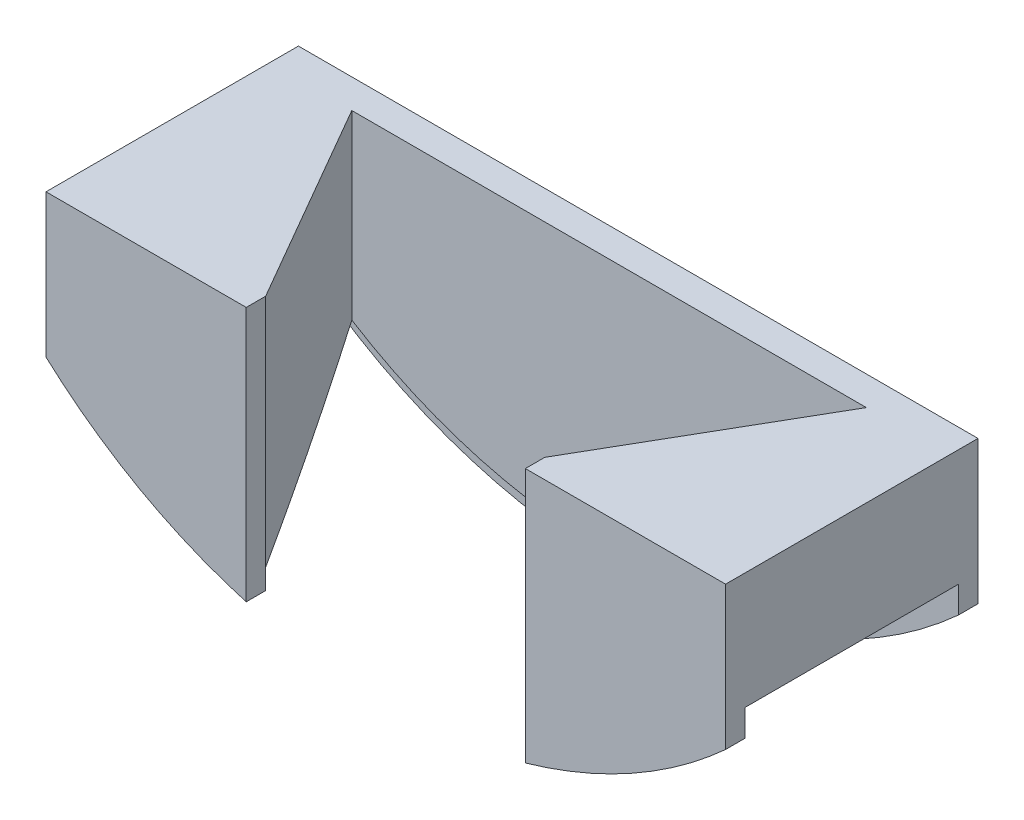
ISO-10303-21;
HEADER;
FILE_DESCRIPTION(('STEP AP214'),'2;1');
FILE_NAME('part.step','',(''),(''),'','','');
FILE_SCHEMA(('AUTOMOTIVE_DESIGN { 1 0 10303 214 1 1 1 1 }'));
ENDSEC;
DATA;
#1=APPLICATION_CONTEXT('core data for automotive mechanical design processes');
#2=APPLICATION_PROTOCOL_DEFINITION('international standard','automotive_design',2000,#1);
#3=PRODUCT_CONTEXT('',#1,'mechanical');
#4=PRODUCT('Part','Part','',(#3));
#5=PRODUCT_RELATED_PRODUCT_CATEGORY('part','',(#4));
#6=PRODUCT_DEFINITION_FORMATION('','',#4);
#7=PRODUCT_DEFINITION_CONTEXT('part definition',#1,'design');
#8=PRODUCT_DEFINITION('design','',#6,#7);
#9=PRODUCT_DEFINITION_SHAPE('','',#8);
#10=(LENGTH_UNIT() NAMED_UNIT(*) SI_UNIT(.MILLI.,.METRE.));
#11=(NAMED_UNIT(*) PLANE_ANGLE_UNIT() SI_UNIT($,.RADIAN.));
#12=(NAMED_UNIT(*) SI_UNIT($,.STERADIAN.) SOLID_ANGLE_UNIT());
#13=UNCERTAINTY_MEASURE_WITH_UNIT(LENGTH_MEASURE(1.E-05),#10,'distance_accuracy_value','');
#14=(GEOMETRIC_REPRESENTATION_CONTEXT(3) GLOBAL_UNCERTAINTY_ASSIGNED_CONTEXT((#13)) GLOBAL_UNIT_ASSIGNED_CONTEXT((#10,
#11,#12)) REPRESENTATION_CONTEXT('',''));
#15=CARTESIAN_POINT('',(0.,0.,0.));
#16=DIRECTION('',(0.,0.,1.));
#17=DIRECTION('',(1.,0.,0.));
#18=AXIS2_PLACEMENT_3D('',#15,#16,#17);
#19=CARTESIAN_POINT('',(0.,14.8535710713571,0.));
#20=DIRECTION('',(0.,0.,1.));
#21=DIRECTION('',(1.,0.,0.));
#22=AXIS2_PLACEMENT_3D('',#19,#20,#21);
#23=CYLINDRICAL_SURFACE('',#22,25.);
#24=DIRECTION('',(0.,0.,-1.));
#25=VECTOR('',#24,1.);
#26=CARTESIAN_POINT('',(-17.5,-3.,12.));
#27=LINE('',#26,#25);
#28=CARTESIAN_POINT('',(-17.5,-3.,12.));
#29=VERTEX_POINT('',#28);
#30=CARTESIAN_POINT('',(-17.5,-3.,1.));
#31=VERTEX_POINT('',#30);
#32=EDGE_CURVE('E53',#29,#31,#27,.T.);
#33=ORIENTED_EDGE('',*,*,#32,.T.);
#34=CARTESIAN_POINT('',(0.,14.8535710713571,1.));
#35=DIRECTION('',(0.,0.,1.));
#36=DIRECTION('',(-1.,0.,0.));
#37=AXIS2_PLACEMENT_3D('',#34,#35,#36);
#38=CIRCLE('',#37,25.);
#39=CARTESIAN_POINT('',(17.5,-3.,1.));
#40=VERTEX_POINT('',#39);
#41=EDGE_CURVE('E48',#31,#40,#38,.T.);
#42=ORIENTED_EDGE('',*,*,#41,.T.);
#43=DIRECTION('',(0.,0.,-1.));
#44=VECTOR('',#43,1.);
#45=CARTESIAN_POINT('',(17.5,-3.,12.));
#46=LINE('',#45,#44);
#47=CARTESIAN_POINT('',(17.5,-3.,12.));
#48=VERTEX_POINT('',#47);
#49=EDGE_CURVE('E257',#48,#40,#46,.T.);
#50=ORIENTED_EDGE('',*,*,#49,.F.);
#51=CARTESIAN_POINT('',(0.,14.8535710713571,12.));
#52=DIRECTION('',(0.,0.,1.));
#53=DIRECTION('',(1.,0.,0.));
#54=AXIS2_PLACEMENT_3D('',#51,#52,#53);
#55=CIRCLE('',#54,25.);
#56=CARTESIAN_POINT('',(7.18782217350886,-9.09084816156674,12.));
#57=VERTEX_POINT('',#56);
#58=EDGE_CURVE('E247',#57,#48,#55,.T.);
#59=ORIENTED_EDGE('',*,*,#58,.F.);
#60=CARTESIAN_POINT('',(0.,14.8535710713571,24.4496732002874));
#61=DIRECTION('',(0.866025403784436,0.,0.500000000000004));
#62=DIRECTION('',(-0.500000000000004,0.,0.866025403784436));
#63=AXIS2_PLACEMENT_3D('',#60,#61,#62);
#64=ELLIPSE('',#63,49.9999999999996,25.);
#65=CARTESIAN_POINT('',(13.25,-6.34636996629673,1.5));
#66=VERTEX_POINT('',#65);
#67=EDGE_CURVE('E234',#66,#57,#64,.F.);
#68=ORIENTED_EDGE('',*,*,#67,.F.);
#69=CARTESIAN_POINT('',(0.,14.8535710713571,1.5));
#70=DIRECTION('',(0.,0.,-1.));
#71=DIRECTION('',(-1.,0.,0.));
#72=AXIS2_PLACEMENT_3D('',#69,#70,#71);
#73=CIRCLE('',#72,25.);
#74=CARTESIAN_POINT('',(-13.25,-6.34636996629673,1.5));
#75=VERTEX_POINT('',#74);
#76=EDGE_CURVE('E243',#75,#66,#73,.F.);
#77=ORIENTED_EDGE('',*,*,#76,.F.);
#78=CARTESIAN_POINT('',(0.,14.8535710713571,24.4496732002874));
#79=DIRECTION('',(-0.866025403784436,0.,0.500000000000004));
#80=DIRECTION('',(0.500000000000004,0.,0.866025403784436));
#81=AXIS2_PLACEMENT_3D('',#78,#79,#80);
#82=ELLIPSE('',#81,49.9999999999996,25.);
#83=CARTESIAN_POINT('',(-7.18782217350886,-9.09084816156674,12.));
#84=VERTEX_POINT('',#83);
#85=EDGE_CURVE('E245',#84,#75,#82,.F.);
#86=ORIENTED_EDGE('',*,*,#85,.F.);
#87=EDGE_CURVE('E248',#29,#84,#55,.T.);
#88=ORIENTED_EDGE('',*,*,#87,.F.);
#89=EDGE_LOOP('',(#33,#42,#50,#59,#68,#77,#86,#88));
#90=FACE_BOUND('',#89,.T.);
#91=ADVANCED_FACE('F33',(#90),#23,.T.);
#92=CARTESIAN_POINT('',(-17.5,3.,12.));
#93=DIRECTION('',(0.,-1.,0.));
#94=DIRECTION('',(0.,0.,-1.));
#95=AXIS2_PLACEMENT_3D('',#92,#93,#94);
#96=PLANE('',#95);
#97=DIRECTION('',(-1.,0.,0.));
#98=VECTOR('',#97,1.);
#99=CARTESIAN_POINT('',(-13.25,3.,1.5));
#100=LINE('',#99,#98);
#101=CARTESIAN_POINT('',(13.25,3.,1.5));
#102=VERTEX_POINT('',#101);
#103=CARTESIAN_POINT('',(-13.25,3.,1.5));
#104=VERTEX_POINT('',#103);
#105=EDGE_CURVE('E225',#102,#104,#100,.T.);
#106=ORIENTED_EDGE('',*,*,#105,.F.);
#107=DIRECTION('',(0.500000000000004,0.,-0.866025403784436));
#108=VECTOR('',#107,1.);
#109=CARTESIAN_POINT('',(13.25,3.,1.5));
#110=LINE('',#109,#108);
#111=CARTESIAN_POINT('',(7.18782217350886,3.,12.));
#112=VERTEX_POINT('',#111);
#113=EDGE_CURVE('E222',#112,#102,#110,.T.);
#114=ORIENTED_EDGE('',*,*,#113,.F.);
#115=DIRECTION('',(0.,0.,-1.));
#116=VECTOR('',#115,1.);
#117=CARTESIAN_POINT('',(7.18782217350886,3.,13.));
#118=LINE('',#117,#116);
#119=CARTESIAN_POINT('',(7.18782217350886,3.,13.));
#120=VERTEX_POINT('',#119);
#121=EDGE_CURVE('E209',#120,#112,#118,.T.);
#122=ORIENTED_EDGE('',*,*,#121,.F.);
#123=DIRECTION('',(-1.,0.,0.));
#124=VECTOR('',#123,1.);
#125=CARTESIAN_POINT('',(17.5,3.,13.));
#126=LINE('',#125,#124);
#127=CARTESIAN_POINT('',(17.5,3.,13.));
#128=VERTEX_POINT('',#127);
#129=EDGE_CURVE('E207',#128,#120,#126,.T.);
#130=ORIENTED_EDGE('',*,*,#129,.F.);
#131=DIRECTION('',(0.,0.,-1.));
#132=VECTOR('',#131,1.);
#133=CARTESIAN_POINT('',(17.5,3.,12.));
#134=LINE('',#133,#132);
#135=CARTESIAN_POINT('',(17.5,3.,0.));
#136=VERTEX_POINT('',#135);
#137=EDGE_CURVE('E11',#128,#136,#134,.T.);
#138=ORIENTED_EDGE('',*,*,#137,.T.);
#139=DIRECTION('',(-1.,0.,0.));
#140=VECTOR('',#139,1.);
#141=CARTESIAN_POINT('',(-17.5,3.,0.));
#142=LINE('',#141,#140);
#143=CARTESIAN_POINT('',(-17.5,3.,0.));
#144=VERTEX_POINT('',#143);
#145=EDGE_CURVE('E254',#136,#144,#142,.T.);
#146=ORIENTED_EDGE('',*,*,#145,.T.);
#147=DIRECTION('',(0.,0.,-1.));
#148=VECTOR('',#147,1.);
#149=CARTESIAN_POINT('',(-17.5,3.,12.));
#150=LINE('',#149,#148);
#151=CARTESIAN_POINT('',(-17.5,3.,13.));
#152=VERTEX_POINT('',#151);
#153=EDGE_CURVE('E41',#152,#144,#150,.T.);
#154=ORIENTED_EDGE('',*,*,#153,.F.);
#155=DIRECTION('',(1.,0.,0.));
#156=VECTOR('',#155,1.);
#157=CARTESIAN_POINT('',(-17.5,3.,13.));
#158=LINE('',#157,#156);
#159=CARTESIAN_POINT('',(-7.18782217350886,3.,13.));
#160=VERTEX_POINT('',#159);
#161=EDGE_CURVE('E173',#152,#160,#158,.T.);
#162=ORIENTED_EDGE('',*,*,#161,.T.);
#163=DIRECTION('',(0.,0.,-1.));
#164=VECTOR('',#163,1.);
#165=CARTESIAN_POINT('',(-7.18782217350886,3.,13.));
#166=LINE('',#165,#164);
#167=CARTESIAN_POINT('',(-7.18782217350886,3.,12.));
#168=VERTEX_POINT('',#167);
#169=EDGE_CURVE('E194',#160,#168,#166,.T.);
#170=ORIENTED_EDGE('',*,*,#169,.T.);
#171=DIRECTION('',(0.500000000000004,0.,0.866025403784436));
#172=VECTOR('',#171,1.);
#173=CARTESIAN_POINT('',(-7.18782217350886,3.,12.));
#174=LINE('',#173,#172);
#175=EDGE_CURVE('E228',#104,#168,#174,.T.);
#176=ORIENTED_EDGE('',*,*,#175,.F.);
#177=EDGE_LOOP('',(#106,#114,#122,#130,#138,#146,#154,#162,#170,#176));
#178=FACE_BOUND('',#177,.T.);
#179=ADVANCED_FACE('F302',(#178),#96,.F.);
#180=CARTESIAN_POINT('',(17.5,-3.,12.));
#181=DIRECTION('',(-1.,0.,0.));
#182=DIRECTION('',(0.,0.,1.));
#183=AXIS2_PLACEMENT_3D('',#180,#181,#182);
#184=PLANE('',#183);
#185=DIRECTION('',(0.,1.,0.));
#186=VECTOR('',#185,1.);
#187=CARTESIAN_POINT('',(17.5,-3.,0.));
#188=LINE('',#187,#186);
#189=CARTESIAN_POINT('',(17.5,-4.3753134516723,0.));
#190=VERTEX_POINT('',#189);
#191=EDGE_CURVE('E251',#190,#136,#188,.T.);
#192=ORIENTED_EDGE('',*,*,#191,.T.);
#193=ORIENTED_EDGE('',*,*,#137,.F.);
#194=DIRECTION('',(0.,1.,0.));
#195=VECTOR('',#194,1.);
#196=CARTESIAN_POINT('',(17.5,-4.37531345167228,13.));
#197=LINE('',#196,#195);
#198=CARTESIAN_POINT('',(17.5,-4.3753134516723,13.));
#199=VERTEX_POINT('',#198);
#200=EDGE_CURVE('E204',#199,#128,#197,.T.);
#201=ORIENTED_EDGE('',*,*,#200,.F.);
#202=DIRECTION('',(0.,0.,-1.));
#203=VECTOR('',#202,1.);
#204=CARTESIAN_POINT('',(17.5,-4.3753134516723,13.));
#205=LINE('',#204,#203);
#206=CARTESIAN_POINT('',(17.5,-4.3753134516723,12.));
#207=VERTEX_POINT('',#206);
#208=EDGE_CURVE('E216',#199,#207,#205,.T.);
#209=ORIENTED_EDGE('',*,*,#208,.T.);
#210=DIRECTION('',(0.,1.,0.));
#211=VECTOR('',#210,1.);
#212=CARTESIAN_POINT('',(17.5,-4.37531345167228,12.));
#213=LINE('',#212,#211);
#214=EDGE_CURVE('E202',#207,#48,#213,.T.);
#215=ORIENTED_EDGE('',*,*,#214,.T.);
#216=ORIENTED_EDGE('',*,*,#49,.T.);
#217=DIRECTION('',(0.,-1.,0.));
#218=VECTOR('',#217,1.);
#219=CARTESIAN_POINT('',(17.5,-4.3753134516723,1.));
#220=LINE('',#219,#218);
#221=CARTESIAN_POINT('',(17.5,-4.3753134516723,1.));
#222=VERTEX_POINT('',#221);
#223=EDGE_CURVE('E151',#40,#222,#220,.T.);
#224=ORIENTED_EDGE('',*,*,#223,.T.);
#225=DIRECTION('',(0.,0.,-1.));
#226=VECTOR('',#225,1.);
#227=CARTESIAN_POINT('',(17.5,-4.3753134516723,1.));
#228=LINE('',#227,#226);
#229=EDGE_CURVE('E150',#222,#190,#228,.T.);
#230=ORIENTED_EDGE('',*,*,#229,.T.);
#231=EDGE_LOOP('',(#192,#193,#201,#209,#215,#216,#224,#230));
#232=FACE_BOUND('',#231,.T.);
#233=ADVANCED_FACE('F35',(#232),#184,.F.);
#234=CARTESIAN_POINT('',(-17.5,-3.,12.));
#235=DIRECTION('',(1.,0.,0.));
#236=DIRECTION('',(0.,0.,-1.));
#237=AXIS2_PLACEMENT_3D('',#234,#235,#236);
#238=PLANE('',#237);
#239=DIRECTION('',(0.,-1.,0.));
#240=VECTOR('',#239,1.);
#241=CARTESIAN_POINT('',(-17.5,-3.,0.));
#242=LINE('',#241,#240);
#243=CARTESIAN_POINT('',(-17.5,-4.3753134516723,0.));
#244=VERTEX_POINT('',#243);
#245=EDGE_CURVE('E145',#144,#244,#242,.T.);
#246=ORIENTED_EDGE('',*,*,#245,.T.);
#247=DIRECTION('',(0.,0.,-1.));
#248=VECTOR('',#247,1.);
#249=CARTESIAN_POINT('',(-17.5,-4.3753134516723,1.));
#250=LINE('',#249,#248);
#251=CARTESIAN_POINT('',(-17.5,-4.3753134516723,1.));
#252=VERTEX_POINT('',#251);
#253=EDGE_CURVE('E139',#252,#244,#250,.T.);
#254=ORIENTED_EDGE('',*,*,#253,.F.);
#255=DIRECTION('',(0.,1.,0.));
#256=VECTOR('',#255,1.);
#257=CARTESIAN_POINT('',(-17.5,-4.3753134516723,1.));
#258=LINE('',#257,#256);
#259=EDGE_CURVE('E142',#252,#31,#258,.T.);
#260=ORIENTED_EDGE('',*,*,#259,.T.);
#261=ORIENTED_EDGE('',*,*,#32,.F.);
#262=DIRECTION('',(0.,1.,0.));
#263=VECTOR('',#262,1.);
#264=CARTESIAN_POINT('',(-17.5,-4.37531345167228,12.));
#265=LINE('',#264,#263);
#266=CARTESIAN_POINT('',(-17.5,-4.3753134516723,12.));
#267=VERTEX_POINT('',#266);
#268=EDGE_CURVE('E185',#267,#29,#265,.T.);
#269=ORIENTED_EDGE('',*,*,#268,.F.);
#270=DIRECTION('',(0.,0.,-1.));
#271=VECTOR('',#270,1.);
#272=CARTESIAN_POINT('',(-17.5,-4.3753134516723,13.));
#273=LINE('',#272,#271);
#274=CARTESIAN_POINT('',(-17.5,-4.3753134516723,13.));
#275=VERTEX_POINT('',#274);
#276=EDGE_CURVE('E192',#275,#267,#273,.T.);
#277=ORIENTED_EDGE('',*,*,#276,.F.);
#278=DIRECTION('',(0.,1.,0.));
#279=VECTOR('',#278,1.);
#280=CARTESIAN_POINT('',(-17.5,-4.37531345167228,13.));
#281=LINE('',#280,#279);
#282=EDGE_CURVE('E177',#275,#152,#281,.T.);
#283=ORIENTED_EDGE('',*,*,#282,.T.);
#284=ORIENTED_EDGE('',*,*,#153,.T.);
#285=EDGE_LOOP('',(#246,#254,#260,#261,#269,#277,#283,#284));
#286=FACE_BOUND('',#285,.T.);
#287=ADVANCED_FACE('F141',(#286),#238,.F.);
#288=CARTESIAN_POINT('',(0.,0.,0.));
#289=DIRECTION('',(0.,0.,-1.));
#290=DIRECTION('',(-1.,0.,0.));
#291=AXIS2_PLACEMENT_3D('',#288,#289,#290);
#292=PLANE('',#291);
#293=ORIENTED_EDGE('',*,*,#191,.F.);
#294=CARTESIAN_POINT('',(0.,14.8535710713571,0.));
#295=DIRECTION('',(0.,0.,-1.));
#296=DIRECTION('',(-1.,0.,0.));
#297=AXIS2_PLACEMENT_3D('',#294,#295,#296);
#298=CIRCLE('',#297,26.);
#299=EDGE_CURVE('E162',#190,#244,#298,.T.);
#300=ORIENTED_EDGE('',*,*,#299,.T.);
#301=ORIENTED_EDGE('',*,*,#245,.F.);
#302=ORIENTED_EDGE('',*,*,#145,.F.);
#303=EDGE_LOOP('',(#293,#300,#301,#302));
#304=FACE_BOUND('',#303,.T.);
#305=ADVANCED_FACE('F263',(#304),#292,.T.);
#306=CARTESIAN_POINT('',(13.25,-10.1464289286429,1.5));
#307=DIRECTION('',(0.866025403784436,0.,0.500000000000004));
#308=DIRECTION('',(0.500000000000004,0.,-0.866025403784436));
#309=AXIS2_PLACEMENT_3D('',#306,#307,#308);
#310=PLANE('',#309);
#311=ORIENTED_EDGE('',*,*,#67,.T.);
#312=DIRECTION('',(0.,1.,0.));
#313=VECTOR('',#312,1.);
#314=CARTESIAN_POINT('',(7.18782217350886,-10.1464289286429,12.));
#315=LINE('',#314,#313);
#316=EDGE_CURVE('E231',#57,#112,#315,.T.);
#317=ORIENTED_EDGE('',*,*,#316,.T.);
#318=ORIENTED_EDGE('',*,*,#113,.T.);
#319=DIRECTION('',(0.,1.,0.));
#320=VECTOR('',#319,1.);
#321=CARTESIAN_POINT('',(13.25,-10.1464289286429,1.5));
#322=LINE('',#321,#320);
#323=EDGE_CURVE('E230',#66,#102,#322,.T.);
#324=ORIENTED_EDGE('',*,*,#323,.F.);
#325=EDGE_LOOP('',(#311,#317,#318,#324));
#326=FACE_BOUND('',#325,.T.);
#327=ADVANCED_FACE('F281',(#326),#310,.F.);
#328=CARTESIAN_POINT('',(-7.18782217350886,-10.1464289286429,12.));
#329=DIRECTION('',(-0.866025403784436,0.,0.500000000000004));
#330=DIRECTION('',(0.500000000000004,0.,0.866025403784436));
#331=AXIS2_PLACEMENT_3D('',#328,#329,#330);
#332=PLANE('',#331);
#333=ORIENTED_EDGE('',*,*,#85,.T.);
#334=DIRECTION('',(0.,1.,0.));
#335=VECTOR('',#334,1.);
#336=CARTESIAN_POINT('',(-13.25,-10.1464289286429,1.5));
#337=LINE('',#336,#335);
#338=EDGE_CURVE('E238',#75,#104,#337,.T.);
#339=ORIENTED_EDGE('',*,*,#338,.T.);
#340=ORIENTED_EDGE('',*,*,#175,.T.);
#341=DIRECTION('',(0.,1.,0.));
#342=VECTOR('',#341,1.);
#343=CARTESIAN_POINT('',(-7.18782217350886,-10.1464289286429,12.));
#344=LINE('',#343,#342);
#345=EDGE_CURVE('E235',#84,#168,#344,.T.);
#346=ORIENTED_EDGE('',*,*,#345,.F.);
#347=EDGE_LOOP('',(#333,#339,#340,#346));
#348=FACE_BOUND('',#347,.T.);
#349=ADVANCED_FACE('F303',(#348),#332,.F.);
#350=CARTESIAN_POINT('',(-13.25,-10.1464289286429,1.5));
#351=DIRECTION('',(0.,0.,-1.));
#352=DIRECTION('',(-1.,0.,0.));
#353=AXIS2_PLACEMENT_3D('',#350,#351,#352);
#354=PLANE('',#353);
#355=ORIENTED_EDGE('',*,*,#76,.T.);
#356=ORIENTED_EDGE('',*,*,#323,.T.);
#357=ORIENTED_EDGE('',*,*,#105,.T.);
#358=ORIENTED_EDGE('',*,*,#338,.F.);
#359=EDGE_LOOP('',(#355,#356,#357,#358));
#360=FACE_BOUND('',#359,.T.);
#361=ADVANCED_FACE('F284',(#360),#354,.F.);
#362=CARTESIAN_POINT('',(7.18782217350886,3.,13.));
#363=DIRECTION('',(1.,0.,0.));
#364=DIRECTION('',(0.,0.,-1.));
#365=AXIS2_PLACEMENT_3D('',#362,#363,#364);
#366=PLANE('',#365);
#367=ORIENTED_EDGE('',*,*,#316,.F.);
#368=DIRECTION('',(0.,-1.,0.));
#369=VECTOR('',#368,1.);
#370=CARTESIAN_POINT('',(7.18782217350886,3.,12.));
#371=LINE('',#370,#369);
#372=CARTESIAN_POINT('',(7.18782217350885,-10.1331296392612,12.));
#373=VERTEX_POINT('',#372);
#374=EDGE_CURVE('E197',#57,#373,#371,.T.);
#375=ORIENTED_EDGE('',*,*,#374,.T.);
#376=DIRECTION('',(0.,0.,-1.));
#377=VECTOR('',#376,1.);
#378=CARTESIAN_POINT('',(7.18782217350885,-10.1331296392612,13.));
#379=LINE('',#378,#377);
#380=CARTESIAN_POINT('',(7.18782217350885,-10.1331296392612,13.));
#381=VERTEX_POINT('',#380);
#382=EDGE_CURVE('E219',#381,#373,#379,.T.);
#383=ORIENTED_EDGE('',*,*,#382,.F.);
#384=DIRECTION('',(0.,-1.,0.));
#385=VECTOR('',#384,1.);
#386=CARTESIAN_POINT('',(7.18782217350886,3.,13.));
#387=LINE('',#386,#385);
#388=EDGE_CURVE('E198',#120,#381,#387,.T.);
#389=ORIENTED_EDGE('',*,*,#388,.F.);
#390=ORIENTED_EDGE('',*,*,#121,.T.);
#391=EDGE_LOOP('',(#367,#375,#383,#389,#390));
#392=FACE_BOUND('',#391,.T.);
#393=ADVANCED_FACE('F275',(#392),#366,.F.);
#394=CARTESIAN_POINT('',(0.,14.8535710713571,13.));
#395=DIRECTION('',(0.,0.,-1.));
#396=DIRECTION('',(-1.,0.,0.));
#397=AXIS2_PLACEMENT_3D('',#394,#395,#396);
#398=CYLINDRICAL_SURFACE('',#397,26.);
#399=CARTESIAN_POINT('',(0.,14.8535710713571,12.));
#400=DIRECTION('',(0.,0.,1.));
#401=DIRECTION('',(1.,0.,0.));
#402=AXIS2_PLACEMENT_3D('',#399,#400,#401);
#403=CIRCLE('',#402,26.);
#404=EDGE_CURVE('E211',#373,#207,#403,.T.);
#405=ORIENTED_EDGE('',*,*,#404,.T.);
#406=ORIENTED_EDGE('',*,*,#208,.F.);
#407=CARTESIAN_POINT('',(0.,14.8535710713571,13.));
#408=DIRECTION('',(0.,0.,1.));
#409=DIRECTION('',(1.,0.,0.));
#410=AXIS2_PLACEMENT_3D('',#407,#408,#409);
#411=CIRCLE('',#410,26.);
#412=EDGE_CURVE('E201',#381,#199,#411,.T.);
#413=ORIENTED_EDGE('',*,*,#412,.F.);
#414=ORIENTED_EDGE('',*,*,#382,.T.);
#415=EDGE_LOOP('',(#405,#406,#413,#414));
#416=FACE_BOUND('',#415,.T.);
#417=ADVANCED_FACE('F369',(#416),#398,.T.);
#418=CARTESIAN_POINT('',(0.,14.8535710713571,13.));
#419=DIRECTION('',(0.,0.,1.));
#420=DIRECTION('',(1.,0.,0.));
#421=AXIS2_PLACEMENT_3D('',#418,#419,#420);
#422=PLANE('',#421);
#423=ORIENTED_EDGE('',*,*,#388,.T.);
#424=ORIENTED_EDGE('',*,*,#412,.T.);
#425=ORIENTED_EDGE('',*,*,#200,.T.);
#426=ORIENTED_EDGE('',*,*,#129,.T.);
#427=EDGE_LOOP('',(#423,#424,#425,#426));
#428=FACE_BOUND('',#427,.T.);
#429=ADVANCED_FACE('F361',(#428),#422,.T.);
#430=CARTESIAN_POINT('',(0.,14.8535710713571,12.));
#431=DIRECTION('',(0.,0.,1.));
#432=DIRECTION('',(1.,0.,0.));
#433=AXIS2_PLACEMENT_3D('',#430,#431,#432);
#434=PLANE('',#433);
#435=ORIENTED_EDGE('',*,*,#58,.T.);
#436=ORIENTED_EDGE('',*,*,#214,.F.);
#437=ORIENTED_EDGE('',*,*,#404,.F.);
#438=ORIENTED_EDGE('',*,*,#374,.F.);
#439=EDGE_LOOP('',(#435,#436,#437,#438));
#440=FACE_BOUND('',#439,.T.);
#441=ADVANCED_FACE('F270',(#440),#434,.F.);
#442=CARTESIAN_POINT('',(-7.18782217350886,3.,13.));
#443=DIRECTION('',(1.,0.,0.));
#444=DIRECTION('',(0.,0.,-1.));
#445=AXIS2_PLACEMENT_3D('',#442,#443,#444);
#446=PLANE('',#445);
#447=ORIENTED_EDGE('',*,*,#345,.T.);
#448=ORIENTED_EDGE('',*,*,#169,.F.);
#449=DIRECTION('',(0.,-1.,0.));
#450=VECTOR('',#449,1.);
#451=CARTESIAN_POINT('',(-7.18782217350886,3.,13.));
#452=LINE('',#451,#450);
#453=CARTESIAN_POINT('',(-7.18782217350885,-10.1331296392612,13.));
#454=VERTEX_POINT('',#453);
#455=EDGE_CURVE('E170',#160,#454,#452,.T.);
#456=ORIENTED_EDGE('',*,*,#455,.T.);
#457=DIRECTION('',(0.,0.,-1.));
#458=VECTOR('',#457,1.);
#459=CARTESIAN_POINT('',(-7.18782217350885,-10.1331296392612,13.));
#460=LINE('',#459,#458);
#461=CARTESIAN_POINT('',(-7.18782217350885,-10.1331296392612,12.));
#462=VERTEX_POINT('',#461);
#463=EDGE_CURVE('E183',#454,#462,#460,.T.);
#464=ORIENTED_EDGE('',*,*,#463,.T.);
#465=DIRECTION('',(0.,-1.,0.));
#466=VECTOR('',#465,1.);
#467=CARTESIAN_POINT('',(-7.18782217350886,3.,12.));
#468=LINE('',#467,#466);
#469=EDGE_CURVE('E168',#84,#462,#468,.T.);
#470=ORIENTED_EDGE('',*,*,#469,.F.);
#471=EDGE_LOOP('',(#447,#448,#456,#464,#470));
#472=FACE_BOUND('',#471,.T.);
#473=ADVANCED_FACE('F294',(#472),#446,.T.);
#474=CARTESIAN_POINT('',(0.,14.8535710713571,13.));
#475=DIRECTION('',(0.,0.,-1.));
#476=DIRECTION('',(-1.,0.,0.));
#477=AXIS2_PLACEMENT_3D('',#474,#475,#476);
#478=CYLINDRICAL_SURFACE('',#477,26.);
#479=CARTESIAN_POINT('',(0.,14.8535710713571,12.));
#480=DIRECTION('',(0.,0.,-1.));
#481=DIRECTION('',(-1.,0.,0.));
#482=AXIS2_PLACEMENT_3D('',#479,#480,#481);
#483=CIRCLE('',#482,26.);
#484=EDGE_CURVE('E174',#462,#267,#483,.T.);
#485=ORIENTED_EDGE('',*,*,#484,.F.);
#486=ORIENTED_EDGE('',*,*,#463,.F.);
#487=CARTESIAN_POINT('',(0.,14.8535710713571,13.));
#488=DIRECTION('',(0.,0.,-1.));
#489=DIRECTION('',(-1.,0.,0.));
#490=AXIS2_PLACEMENT_3D('',#487,#488,#489);
#491=CIRCLE('',#490,26.);
#492=EDGE_CURVE('E180',#454,#275,#491,.T.);
#493=ORIENTED_EDGE('',*,*,#492,.T.);
#494=ORIENTED_EDGE('',*,*,#276,.T.);
#495=EDGE_LOOP('',(#485,#486,#493,#494));
#496=FACE_BOUND('',#495,.T.);
#497=ADVANCED_FACE('F299',(#496),#478,.T.);
#498=CARTESIAN_POINT('',(0.,14.8535710713571,13.));
#499=DIRECTION('',(0.,0.,1.));
#500=DIRECTION('',(-1.,0.,0.));
#501=AXIS2_PLACEMENT_3D('',#498,#499,#500);
#502=PLANE('',#501);
#503=ORIENTED_EDGE('',*,*,#455,.F.);
#504=ORIENTED_EDGE('',*,*,#161,.F.);
#505=ORIENTED_EDGE('',*,*,#282,.F.);
#506=ORIENTED_EDGE('',*,*,#492,.F.);
#507=EDGE_LOOP('',(#503,#504,#505,#506));
#508=FACE_BOUND('',#507,.T.);
#509=ADVANCED_FACE('F301',(#508),#502,.T.);
#510=CARTESIAN_POINT('',(0.,14.8535710713571,12.));
#511=DIRECTION('',(0.,0.,1.));
#512=DIRECTION('',(-1.,0.,0.));
#513=AXIS2_PLACEMENT_3D('',#510,#511,#512);
#514=PLANE('',#513);
#515=ORIENTED_EDGE('',*,*,#87,.T.);
#516=ORIENTED_EDGE('',*,*,#469,.T.);
#517=ORIENTED_EDGE('',*,*,#484,.T.);
#518=ORIENTED_EDGE('',*,*,#268,.T.);
#519=EDGE_LOOP('',(#515,#516,#517,#518));
#520=FACE_BOUND('',#519,.T.);
#521=ADVANCED_FACE('F291',(#520),#514,.F.);
#522=CARTESIAN_POINT('',(0.,14.8535710713571,1.));
#523=DIRECTION('',(0.,0.,-1.));
#524=DIRECTION('',(-1.,0.,0.));
#525=AXIS2_PLACEMENT_3D('',#522,#523,#524);
#526=CYLINDRICAL_SURFACE('',#525,26.);
#527=ORIENTED_EDGE('',*,*,#299,.F.);
#528=ORIENTED_EDGE('',*,*,#229,.F.);
#529=CARTESIAN_POINT('',(0.,14.8535710713571,1.));
#530=DIRECTION('',(0.,0.,-1.));
#531=DIRECTION('',(-1.,0.,0.));
#532=AXIS2_PLACEMENT_3D('',#529,#530,#531);
#533=CIRCLE('',#532,26.);
#534=EDGE_CURVE('E157',#222,#252,#533,.T.);
#535=ORIENTED_EDGE('',*,*,#534,.T.);
#536=ORIENTED_EDGE('',*,*,#253,.T.);
#537=EDGE_LOOP('',(#527,#528,#535,#536));
#538=FACE_BOUND('',#537,.T.);
#539=ADVANCED_FACE('F160',(#538),#526,.T.);
#540=CARTESIAN_POINT('',(0.,14.8535710713571,1.));
#541=DIRECTION('',(0.,0.,-1.));
#542=DIRECTION('',(-1.,0.,0.));
#543=AXIS2_PLACEMENT_3D('',#540,#541,#542);
#544=PLANE('',#543);
#545=ORIENTED_EDGE('',*,*,#534,.F.);
#546=ORIENTED_EDGE('',*,*,#223,.F.);
#547=ORIENTED_EDGE('',*,*,#41,.F.);
#548=ORIENTED_EDGE('',*,*,#259,.F.);
#549=EDGE_LOOP('',(#545,#546,#547,#548));
#550=FACE_BOUND('',#549,.T.);
#551=ADVANCED_FACE('F155',(#550),#544,.F.);
#552=CLOSED_SHELL('',(#91,#179,#233,#287,#305,#327,#349,#361,#393,#417,#429,#441,#473,#497,#509,
#521,#539,#551));
#553=MANIFOLD_SOLID_BREP('B2',#552);
#554=ADVANCED_BREP_SHAPE_REPRESENTATION('',(#18,#553),#14);
#555=SHAPE_DEFINITION_REPRESENTATION(#9,#554);
ENDSEC;
END-ISO-10303-21;
